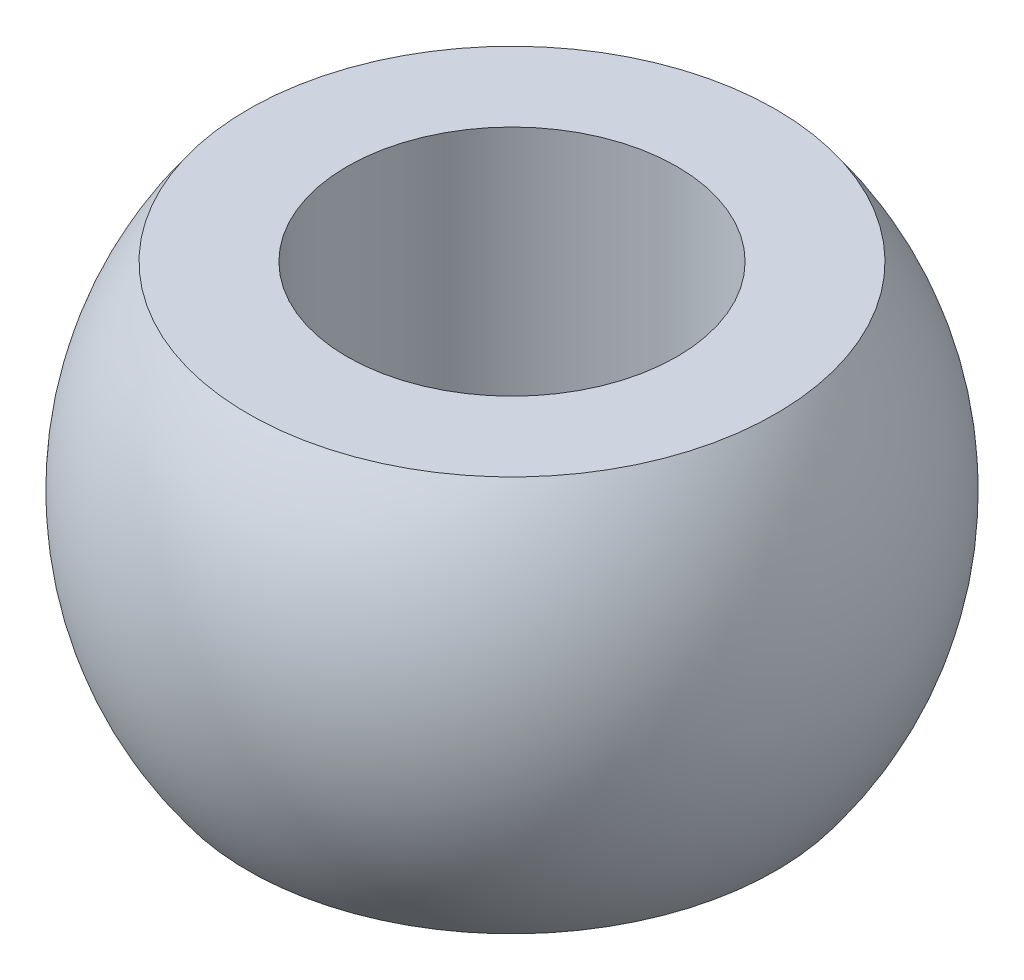
ISO-10303-21;
HEADER;
FILE_DESCRIPTION(('STEP AP214'),'2;1');
FILE_NAME('part.step','',(''),(''),'','','');
FILE_SCHEMA(('AUTOMOTIVE_DESIGN { 1 0 10303 214 1 1 1 1 }'));
ENDSEC;
DATA;
#1=APPLICATION_CONTEXT('core data for automotive mechanical design processes');
#2=APPLICATION_PROTOCOL_DEFINITION('international standard','automotive_design',2000,#1);
#3=PRODUCT_CONTEXT('',#1,'mechanical');
#4=PRODUCT('Part','Part','',(#3));
#5=PRODUCT_RELATED_PRODUCT_CATEGORY('part','',(#4));
#6=PRODUCT_DEFINITION_FORMATION('','',#4);
#7=PRODUCT_DEFINITION_CONTEXT('part definition',#1,'design');
#8=PRODUCT_DEFINITION('design','',#6,#7);
#9=PRODUCT_DEFINITION_SHAPE('','',#8);
#10=(LENGTH_UNIT() NAMED_UNIT(*) SI_UNIT(.MILLI.,.METRE.));
#11=(NAMED_UNIT(*) PLANE_ANGLE_UNIT() SI_UNIT($,.RADIAN.));
#12=(NAMED_UNIT(*) SI_UNIT($,.STERADIAN.) SOLID_ANGLE_UNIT());
#13=UNCERTAINTY_MEASURE_WITH_UNIT(LENGTH_MEASURE(1.E-05),#10,'distance_accuracy_value','');
#14=(GEOMETRIC_REPRESENTATION_CONTEXT(3) GLOBAL_UNCERTAINTY_ASSIGNED_CONTEXT((#13)) GLOBAL_UNIT_ASSIGNED_CONTEXT((#10,
#11,#12)) REPRESENTATION_CONTEXT('',''));
#15=CARTESIAN_POINT('',(0.,0.,0.));
#16=DIRECTION('',(0.,0.,1.));
#17=DIRECTION('',(1.,0.,0.));
#18=AXIS2_PLACEMENT_3D('',#15,#16,#17);
#19=CARTESIAN_POINT('',(0.,4.7625,-3.96875));
#20=DIRECTION('',(0.,1.,0.));
#21=DIRECTION('',(0.,0.,1.));
#22=AXIS2_PLACEMENT_3D('',#19,#20,#21);
#23=PLANE('',#22);
#24=CARTESIAN_POINT('',(0.,4.7625,0.));
#25=DIRECTION('',(0.,-1.,0.));
#26=DIRECTION('',(0.,0.,-1.));
#27=AXIS2_PLACEMENT_3D('',#24,#25,#26);
#28=CIRCLE('',#27,3.96875);
#29=CARTESIAN_POINT('',(0.,4.7625,-3.96875));
#30=VERTEX_POINT('',#29);
#31=EDGE_CURVE('E10',#30,#30,#28,.T.);
#32=ORIENTED_EDGE('',*,*,#31,.T.);
#33=EDGE_LOOP('',(#32));
#34=FACE_BOUND('',#33,.T.);
#35=CARTESIAN_POINT('',(0.,4.7625,0.));
#36=DIRECTION('',(0.,-1.,0.));
#37=DIRECTION('',(0.,0.,-1.));
#38=AXIS2_PLACEMENT_3D('',#35,#36,#37);
#39=CIRCLE('',#38,6.35);
#40=CARTESIAN_POINT('',(0.,4.7625,-6.35));
#41=VERTEX_POINT('',#40);
#42=EDGE_CURVE('E44',#41,#41,#39,.T.);
#43=ORIENTED_EDGE('',*,*,#42,.F.);
#44=EDGE_LOOP('',(#43));
#45=FACE_BOUND('',#44,.T.);
#46=ADVANCED_FACE('F30',(#34,#45),#23,.T.);
#47=CARTESIAN_POINT('',(0.,-4.7625,0.));
#48=DIRECTION('',(0.,-1.,0.));
#49=DIRECTION('',(0.,0.,-1.));
#50=AXIS2_PLACEMENT_3D('',#47,#48,#49);
#51=CYLINDRICAL_SURFACE('',#50,3.96875);
#52=CARTESIAN_POINT('',(0.,-4.7625,0.));
#53=DIRECTION('',(0.,-1.,0.));
#54=DIRECTION('',(0.,0.,-1.));
#55=AXIS2_PLACEMENT_3D('',#52,#53,#54);
#56=CIRCLE('',#55,3.96875);
#57=CARTESIAN_POINT('',(0.,-4.7625,-3.96875));
#58=VERTEX_POINT('',#57);
#59=EDGE_CURVE('E36',#58,#58,#56,.T.);
#60=ORIENTED_EDGE('',*,*,#59,.T.);
#61=EDGE_LOOP('',(#60));
#62=FACE_BOUND('',#61,.T.);
#63=ORIENTED_EDGE('',*,*,#31,.F.);
#64=EDGE_LOOP('',(#63));
#65=FACE_BOUND('',#64,.T.);
#66=ADVANCED_FACE('F54',(#62,#65),#51,.F.);
#67=CARTESIAN_POINT('',(0.,-4.7625,-3.96875));
#68=DIRECTION('',(0.,-1.,0.));
#69=DIRECTION('',(0.,0.,-1.));
#70=AXIS2_PLACEMENT_3D('',#67,#68,#69);
#71=PLANE('',#70);
#72=CARTESIAN_POINT('',(0.,-4.7625,0.));
#73=DIRECTION('',(0.,-1.,0.));
#74=DIRECTION('',(0.,0.,-1.));
#75=AXIS2_PLACEMENT_3D('',#72,#73,#74);
#76=CIRCLE('',#75,6.35);
#77=CARTESIAN_POINT('',(0.,-4.7625,-6.35));
#78=VERTEX_POINT('',#77);
#79=EDGE_CURVE('E40',#78,#78,#76,.T.);
#80=ORIENTED_EDGE('',*,*,#79,.T.);
#81=EDGE_LOOP('',(#80));
#82=FACE_BOUND('',#81,.T.);
#83=ORIENTED_EDGE('',*,*,#59,.F.);
#84=EDGE_LOOP('',(#83));
#85=FACE_BOUND('',#84,.T.);
#86=ADVANCED_FACE('F58',(#82,#85),#71,.T.);
#87=CARTESIAN_POINT('',(0.,0.,0.));
#88=DIRECTION('',(0.,-1.,0.));
#89=DIRECTION('',(0.,0.,-1.));
#90=AXIS2_PLACEMENT_3D('',#87,#88,#89);
#91=SPHERICAL_SURFACE('',#90,7.9375);
#92=CARTESIAN_POINT('',(0.,4.7625,-6.35));
#93=CARTESIAN_POINT('',(0.,4.67737087229087,-6.41384839832648));
#94=CARTESIAN_POINT('',(0.,4.59095641696462,-6.47598288221651));
#95=CARTESIAN_POINT('',(0.,4.41569970901757,-6.59672802364794));
#96=CARTESIAN_POINT('',(0.,4.32685745639677,-6.65533868118935));
#97=CARTESIAN_POINT('',(0.,4.14688801180029,-6.76894017244781));
#98=CARTESIAN_POINT('',(0.,4.05576081982462,-6.82393100616487));
#99=CARTESIAN_POINT('',(0.,3.87136910209063,-6.93020423386661));
#100=CARTESIAN_POINT('',(0.,3.77810457633231,-6.98148662785129));
#101=CARTESIAN_POINT('',(0.,3.58958897147636,-7.08025994878628));
#102=CARTESIAN_POINT('',(0.,3.49433789237872,-7.12775087573658));
#103=CARTESIAN_POINT('',(0.,3.30200324974922,-7.21886447701541));
#104=CARTESIAN_POINT('',(0.,3.20491968621736,-7.26248715134393));
#105=CARTESIAN_POINT('',(0.,3.00907708712593,-7.34579368867551));
#106=CARTESIAN_POINT('',(0.,2.91031805156636,-7.38547755167858));
#107=CARTESIAN_POINT('',(0.,2.71128423604967,-7.46084228590643));
#108=CARTESIAN_POINT('',(0.,2.61100945609254,-7.49652315713121));
#109=CARTESIAN_POINT('',(0.,2.40910632942476,-7.5638241994207));
#110=CARTESIAN_POINT('',(0.,2.3074779827141,-7.5954443704854));
#111=CARTESIAN_POINT('',(0.,2.10303208974408,-7.65457287215223));
#112=CARTESIAN_POINT('',(0.,2.00021454348472,-7.68208120275435));
#113=CARTESIAN_POINT('',(0.,1.79355654185231,-7.73294153326719));
#114=CARTESIAN_POINT('',(0.,1.68971608647926,-7.7562935331779));
#115=CARTESIAN_POINT('',(0.,1.48118021146958,-7.79880343430045));
#116=CARTESIAN_POINT('',(0.,1.37648479183295,-7.81796133551228));
#117=CARTESIAN_POINT('',(0.,1.16640831590266,-7.85205205448298));
#118=CARTESIAN_POINT('',(0.,1.061027259609,-7.86698487224185));
#119=CARTESIAN_POINT('',(0.,0.849749946877691,-7.89260127293249));
#120=CARTESIAN_POINT('',(0.,0.743853690440032,-7.90328485586426));
#121=CARTESIAN_POINT('',(0.,0.531717247184614,-7.9203855079637));
#122=CARTESIAN_POINT('',(0.,0.425477060366855,-7.92680257713137));
#123=CARTESIAN_POINT('',(0.,0.212824582366064,-7.93535982314951));
#124=CARTESIAN_POINT('',(0.,0.106412291183032,-7.9375));
#125=CARTESIAN_POINT('',(0.,-0.106412291183032,-7.9375));
#126=CARTESIAN_POINT('',(0.,-0.212824582366064,-7.93535982314951));
#127=CARTESIAN_POINT('',(0.,-0.425477060366855,-7.92680257713137));
#128=CARTESIAN_POINT('',(0.,-0.531717247184614,-7.9203855079637));
#129=CARTESIAN_POINT('',(0.,-0.743853690440032,-7.90328485586426));
#130=CARTESIAN_POINT('',(0.,-0.849749946877691,-7.89260127293249));
#131=CARTESIAN_POINT('',(0.,-1.061027259609,-7.86698487224185));
#132=CARTESIAN_POINT('',(0.,-1.16640831590266,-7.85205205448298));
#133=CARTESIAN_POINT('',(0.,-1.37648479183295,-7.81796133551228));
#134=CARTESIAN_POINT('',(0.,-1.48118021146958,-7.79880343430045));
#135=CARTESIAN_POINT('',(0.,-1.68971608647926,-7.7562935331779));
#136=CARTESIAN_POINT('',(0.,-1.79355654185231,-7.73294153326719));
#137=CARTESIAN_POINT('',(0.,-2.00021454348472,-7.68208120275435));
#138=CARTESIAN_POINT('',(0.,-2.10303208974408,-7.65457287215223));
#139=CARTESIAN_POINT('',(0.,-2.3074779827141,-7.5954443704854));
#140=CARTESIAN_POINT('',(0.,-2.40910632942476,-7.5638241994207));
#141=CARTESIAN_POINT('',(0.,-2.61100945609254,-7.49652315713121));
#142=CARTESIAN_POINT('',(0.,-2.71128423604967,-7.46084228590643));
#143=CARTESIAN_POINT('',(0.,-2.91031805156636,-7.38547755167858));
#144=CARTESIAN_POINT('',(0.,-3.00907708712593,-7.34579368867551));
#145=CARTESIAN_POINT('',(0.,-3.20491968621736,-7.26248715134393));
#146=CARTESIAN_POINT('',(0.,-3.30200324974922,-7.21886447701541));
#147=CARTESIAN_POINT('',(0.,-3.49433789237872,-7.12775087573658));
#148=CARTESIAN_POINT('',(0.,-3.58958897147636,-7.08025994878628));
#149=CARTESIAN_POINT('',(0.,-3.77810457633231,-6.98148662785129));
#150=CARTESIAN_POINT('',(0.,-3.87136910209063,-6.93020423386661));
#151=CARTESIAN_POINT('',(0.,-4.05576081982462,-6.82393100616487));
#152=CARTESIAN_POINT('',(0.,-4.14688801180029,-6.76894017244781));
#153=CARTESIAN_POINT('',(0.,-4.32685745639677,-6.65533868118935));
#154=CARTESIAN_POINT('',(0.,-4.41569970901757,-6.59672802364794));
#155=CARTESIAN_POINT('',(0.,-4.59095641696462,-6.47598288221651));
#156=CARTESIAN_POINT('',(0.,-4.67737087229087,-6.41384839832648));
#157=CARTESIAN_POINT('',(0.,-4.7625,-6.35));
#158=B_SPLINE_CURVE_WITH_KNOTS('',3,(#92,#93,#94,#95,#96,#97,#98,#99,#100,#101,#102,#103,#104,
#105,#106,#107,#108,#109,#110,#111,#112,#113,#114,#115,#116,#117,#118,#119,#120,#121,#122,#123,
#124,#125,#126,#127,#128,#129,#130,#131,#132,#133,#134,#135,#136,#137,#138,#139,#140,#141,#142,
#143,#144,#145,#146,#147,#148,#149,#150,#151,#152,#153,#154,#155,#156,#157),.UNSPECIFIED.,.F.,
.F.,(4,2,2,2,2,2,2,2,2,2,2,2,2,2,2,2,2,2,2,2,2,2,2,2,2,2,2,2,2,2,2,2,4),(0.,0.319215362679372,
0.638430725358744,0.957646088038116,1.27686145071749,1.59607681339686,1.91529217607623,
2.2345075387556,2.55372290143497,2.87293826411435,3.19215362679372,3.51136898947309,
3.83058435215246,4.14979971483183,4.4690150775112,4.78823044019058,5.10744580286995,
5.42666116554932,5.74587652822869,6.06509189090807,6.38430725358744,6.70352261626681,
7.02273797894618,7.34195334162555,7.66116870430492,7.9803840669843,8.29959942966367,
8.61881479234304,8.93803015502241,9.25724551770178,9.57646088038116,9.89567624306053,
10.2148916057399),.UNSPECIFIED.);
#159=EDGE_CURVE('BSEAM50',#41,#78,#158,.T.);
#160=ORIENTED_EDGE('',*,*,#42,.T.);
#161=ORIENTED_EDGE('',*,*,#79,.F.);
#162=ORIENTED_EDGE('',*,*,#159,.T.);
#163=ORIENTED_EDGE('',*,*,#159,.F.);
#164=EDGE_LOOP('',(#160,#162,#161,#163));
#165=FACE_BOUND('',#164,.T.);
#166=ADVANCED_FACE('F50',(#165),#91,.T.);
#167=CLOSED_SHELL('',(#46,#66,#86,#166));
#168=MANIFOLD_SOLID_BREP('B2',#167);
#169=ADVANCED_BREP_SHAPE_REPRESENTATION('',(#18,#168),#14);
#170=SHAPE_DEFINITION_REPRESENTATION(#9,#169);
ENDSEC;
END-ISO-10303-21;
